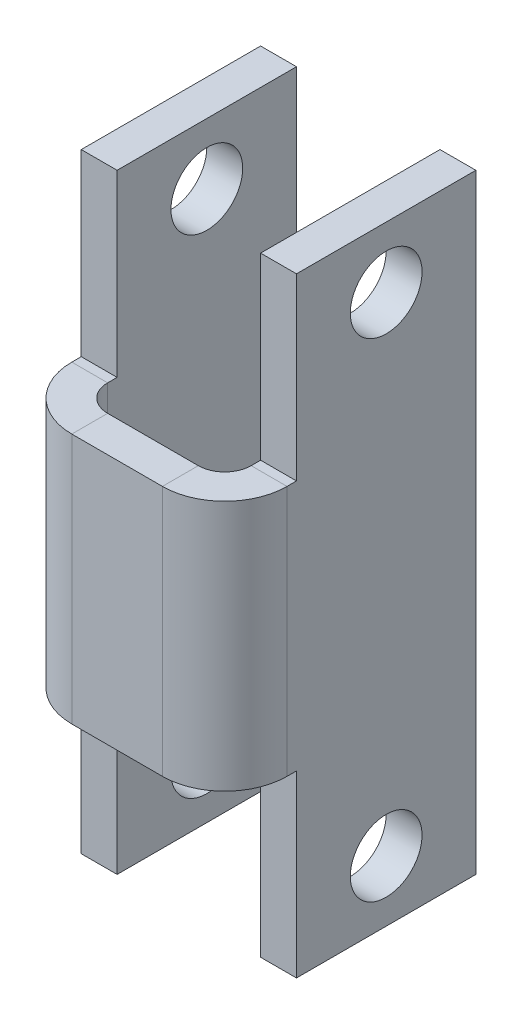
ISO-10303-21;
HEADER;
FILE_DESCRIPTION(('STEP AP214'),'2;1');
FILE_NAME('part.step','',(''),(''),'','','');
FILE_SCHEMA(('AUTOMOTIVE_DESIGN { 1 0 10303 214 1 1 1 1 }'));
ENDSEC;
DATA;
#1=APPLICATION_CONTEXT('core data for automotive mechanical design processes');
#2=APPLICATION_PROTOCOL_DEFINITION('international standard','automotive_design',2000,#1);
#3=PRODUCT_CONTEXT('',#1,'mechanical');
#4=PRODUCT('Part','Part','',(#3));
#5=PRODUCT_RELATED_PRODUCT_CATEGORY('part','',(#4));
#6=PRODUCT_DEFINITION_FORMATION('','',#4);
#7=PRODUCT_DEFINITION_CONTEXT('part definition',#1,'design');
#8=PRODUCT_DEFINITION('design','',#6,#7);
#9=PRODUCT_DEFINITION_SHAPE('','',#8);
#10=(LENGTH_UNIT() NAMED_UNIT(*) SI_UNIT(.MILLI.,.METRE.));
#11=(NAMED_UNIT(*) PLANE_ANGLE_UNIT() SI_UNIT($,.RADIAN.));
#12=(NAMED_UNIT(*) SI_UNIT($,.STERADIAN.) SOLID_ANGLE_UNIT());
#13=UNCERTAINTY_MEASURE_WITH_UNIT(LENGTH_MEASURE(1.E-05),#10,'distance_accuracy_value','');
#14=(GEOMETRIC_REPRESENTATION_CONTEXT(3) GLOBAL_UNCERTAINTY_ASSIGNED_CONTEXT((#13)) GLOBAL_UNIT_ASSIGNED_CONTEXT((#10,
#11,#12)) REPRESENTATION_CONTEXT('',''));
#15=CARTESIAN_POINT('',(0.,0.,0.));
#16=DIRECTION('',(0.,0.,1.));
#17=DIRECTION('',(1.,0.,0.));
#18=AXIS2_PLACEMENT_3D('',#15,#16,#17);
#19=CARTESIAN_POINT('',(-4.,5.,0.));
#20=DIRECTION('',(0.,1.,0.));
#21=DIRECTION('',(0.,0.,1.));
#22=AXIS2_PLACEMENT_3D('',#19,#20,#21);
#23=PLANE('',#22);
#24=DIRECTION('',(0.,0.,1.));
#25=VECTOR('',#24,1.);
#26=CARTESIAN_POINT('',(1.,5.,0.));
#27=LINE('',#26,#25);
#28=CARTESIAN_POINT('',(0.999999999999997,5.,-2.00000000000002));
#29=VERTEX_POINT('',#28);
#30=CARTESIAN_POINT('',(0.999999999999997,5.,-1.7366));
#31=VERTEX_POINT('',#30);
#32=EDGE_CURVE('E276',#29,#31,#27,.T.);
#33=ORIENTED_EDGE('',*,*,#32,.T.);
#34=DIRECTION('',(-1.,0.,0.));
#35=VECTOR('',#34,1.);
#36=CARTESIAN_POINT('',(0.999999999999997,5.,-1.7366));
#37=LINE('',#36,#35);
#38=CARTESIAN_POINT('',(0.,5.,-1.73659999999999));
#39=VERTEX_POINT('',#38);
#40=EDGE_CURVE('E13',#31,#39,#37,.T.);
#41=ORIENTED_EDGE('',*,*,#40,.T.);
#42=DIRECTION('',(0.,0.,1.));
#43=VECTOR('',#42,1.);
#44=CARTESIAN_POINT('',(0.,5.,0.));
#45=LINE('',#44,#43);
#46=CARTESIAN_POINT('',(0.,5.,-2.00000000000002));
#47=VERTEX_POINT('',#46);
#48=EDGE_CURVE('E332',#47,#39,#45,.T.);
#49=ORIENTED_EDGE('',*,*,#48,.F.);
#50=DIRECTION('',(1.,0.,0.));
#51=VECTOR('',#50,1.);
#52=CARTESIAN_POINT('',(-4.,5.,-2.00000000000003));
#53=LINE('',#52,#51);
#54=EDGE_CURVE('E315',#47,#29,#53,.T.);
#55=ORIENTED_EDGE('',*,*,#54,.T.);
#56=EDGE_LOOP('',(#33,#41,#49,#55));
#57=FACE_BOUND('',#56,.T.);
#58=ADVANCED_FACE('F81',(#57),#23,.F.);
#59=DIRECTION('',(1.,0.,0.));
#60=VECTOR('',#59,1.);
#61=CARTESIAN_POINT('',(-4.,5.,0.));
#62=LINE('',#61,#60);
#63=CARTESIAN_POINT('',(1.73659999999999,5.,0.));
#64=VERTEX_POINT('',#63);
#65=CARTESIAN_POINT('',(4.2634,5.,0.));
#66=VERTEX_POINT('',#65);
#67=EDGE_CURVE('E311',#64,#66,#62,.T.);
#68=ORIENTED_EDGE('',*,*,#67,.F.);
#69=DIRECTION('',(0.,0.,-1.));
#70=VECTOR('',#69,1.);
#71=CARTESIAN_POINT('',(1.73659999999999,5.,0.));
#72=LINE('',#71,#70);
#73=CARTESIAN_POINT('',(1.7366,5.,-1.));
#74=VERTEX_POINT('',#73);
#75=EDGE_CURVE('E90',#64,#74,#72,.T.);
#76=ORIENTED_EDGE('',*,*,#75,.T.);
#77=DIRECTION('',(1.,0.,0.));
#78=VECTOR('',#77,1.);
#79=CARTESIAN_POINT('',(0.,5.,-1.));
#80=LINE('',#79,#78);
#81=CARTESIAN_POINT('',(4.2634,5.,-1.));
#82=VERTEX_POINT('',#81);
#83=EDGE_CURVE('E324',#74,#82,#80,.T.);
#84=ORIENTED_EDGE('',*,*,#83,.T.);
#85=DIRECTION('',(0.,0.,1.));
#86=VECTOR('',#85,1.);
#87=CARTESIAN_POINT('',(4.2634,5.,-1.));
#88=LINE('',#87,#86);
#89=EDGE_CURVE('E288',#82,#66,#88,.T.);
#90=ORIENTED_EDGE('',*,*,#89,.T.);
#91=EDGE_LOOP('',(#68,#76,#84,#90));
#92=FACE_BOUND('',#91,.T.);
#93=ADVANCED_FACE('F503',(#92),#23,.F.);
#94=ORIENTED_EDGE('',*,*,#40,.F.);
#95=CARTESIAN_POINT('',(1.7366,5.,-1.7366));
#96=DIRECTION('',(0.,1.,0.));
#97=DIRECTION('',(0.,0.,1.));
#98=AXIS2_PLACEMENT_3D('',#95,#96,#97);
#99=CIRCLE('',#98,0.7366);
#100=EDGE_CURVE('E321',#74,#31,#99,.F.);
#101=ORIENTED_EDGE('',*,*,#100,.F.);
#102=ORIENTED_EDGE('',*,*,#75,.F.);
#103=CARTESIAN_POINT('',(1.7366,5.,-1.7366));
#104=DIRECTION('',(0.,1.,0.));
#105=DIRECTION('',(0.,0.,1.));
#106=AXIS2_PLACEMENT_3D('',#103,#104,#105);
#107=CIRCLE('',#106,1.7366);
#108=EDGE_CURVE('E335',#64,#39,#107,.F.);
#109=ORIENTED_EDGE('',*,*,#108,.T.);
#110=EDGE_LOOP('',(#94,#101,#102,#109));
#111=FACE_BOUND('',#110,.T.);
#112=ADVANCED_FACE('F508',(#111),#23,.F.);
#113=DIRECTION('',(0.,0.,1.));
#114=VECTOR('',#113,1.);
#115=CARTESIAN_POINT('',(6.,5.,0.));
#116=LINE('',#115,#114);
#117=CARTESIAN_POINT('',(6.,5.,-2.));
#118=VERTEX_POINT('',#117);
#119=CARTESIAN_POINT('',(6.,5.,-1.73659999999999));
#120=VERTEX_POINT('',#119);
#121=EDGE_CURVE('E230',#118,#120,#116,.T.);
#122=ORIENTED_EDGE('',*,*,#121,.T.);
#123=DIRECTION('',(-1.,0.,0.));
#124=VECTOR('',#123,1.);
#125=CARTESIAN_POINT('',(6.,5.,-1.73659999999999));
#126=LINE('',#125,#124);
#127=CARTESIAN_POINT('',(5.,5.,-1.7366));
#128=VERTEX_POINT('',#127);
#129=EDGE_CURVE('E286',#120,#128,#126,.T.);
#130=ORIENTED_EDGE('',*,*,#129,.T.);
#131=DIRECTION('',(0.,0.,-1.));
#132=VECTOR('',#131,1.);
#133=CARTESIAN_POINT('',(5.,5.,0.));
#134=LINE('',#133,#132);
#135=CARTESIAN_POINT('',(5.,5.,-2.));
#136=VERTEX_POINT('',#135);
#137=EDGE_CURVE('E330',#128,#136,#134,.T.);
#138=ORIENTED_EDGE('',*,*,#137,.T.);
#139=EDGE_CURVE('E316',#136,#118,#53,.T.);
#140=ORIENTED_EDGE('',*,*,#139,.T.);
#141=EDGE_LOOP('',(#122,#130,#138,#140));
#142=FACE_BOUND('',#141,.T.);
#143=ADVANCED_FACE('F506',(#142),#23,.F.);
#144=CARTESIAN_POINT('',(-4.,12.,0.));
#145=DIRECTION('',(0.,-1.,0.));
#146=DIRECTION('',(0.,0.,-1.));
#147=AXIS2_PLACEMENT_3D('',#144,#145,#146);
#148=PLANE('',#147);
#149=DIRECTION('',(0.,0.,-1.));
#150=VECTOR('',#149,1.);
#151=CARTESIAN_POINT('',(0.,12.,0.));
#152=LINE('',#151,#150);
#153=CARTESIAN_POINT('',(0.,12.,-1.73659999999999));
#154=VERTEX_POINT('',#153);
#155=CARTESIAN_POINT('',(0.,12.,-2.00000000000002));
#156=VERTEX_POINT('',#155);
#157=EDGE_CURVE('E368',#154,#156,#152,.T.);
#158=ORIENTED_EDGE('',*,*,#157,.F.);
#159=DIRECTION('',(1.,0.,0.));
#160=VECTOR('',#159,1.);
#161=CARTESIAN_POINT('',(0.,12.,-1.73659999999999));
#162=LINE('',#161,#160);
#163=CARTESIAN_POINT('',(0.999999999999997,12.,-1.7366));
#164=VERTEX_POINT('',#163);
#165=EDGE_CURVE('E106',#154,#164,#162,.T.);
#166=ORIENTED_EDGE('',*,*,#165,.T.);
#167=DIRECTION('',(0.,0.,-1.));
#168=VECTOR('',#167,1.);
#169=CARTESIAN_POINT('',(1.,12.,0.));
#170=LINE('',#169,#168);
#171=CARTESIAN_POINT('',(0.999999999999997,12.,-2.00000000000001));
#172=VERTEX_POINT('',#171);
#173=EDGE_CURVE('E267',#164,#172,#170,.T.);
#174=ORIENTED_EDGE('',*,*,#173,.T.);
#175=DIRECTION('',(1.,0.,0.));
#176=VECTOR('',#175,1.);
#177=CARTESIAN_POINT('',(-4.,12.,-2.00000000000003));
#178=LINE('',#177,#176);
#179=EDGE_CURVE('E351',#156,#172,#178,.T.);
#180=ORIENTED_EDGE('',*,*,#179,.F.);
#181=EDGE_LOOP('',(#158,#166,#174,#180));
#182=FACE_BOUND('',#181,.T.);
#183=ADVANCED_FACE('F462',(#182),#148,.F.);
#184=DIRECTION('',(-1.,0.,0.));
#185=VECTOR('',#184,1.);
#186=CARTESIAN_POINT('',(0.,12.,-1.));
#187=LINE('',#186,#185);
#188=CARTESIAN_POINT('',(4.2634,12.,-1.));
#189=VERTEX_POINT('',#188);
#190=CARTESIAN_POINT('',(1.7366,12.,-1.));
#191=VERTEX_POINT('',#190);
#192=EDGE_CURVE('E359',#189,#191,#187,.T.);
#193=ORIENTED_EDGE('',*,*,#192,.T.);
#194=DIRECTION('',(0.,0.,1.));
#195=VECTOR('',#194,1.);
#196=CARTESIAN_POINT('',(1.7366,12.,-1.));
#197=LINE('',#196,#195);
#198=CARTESIAN_POINT('',(1.73659999999999,12.,0.));
#199=VERTEX_POINT('',#198);
#200=EDGE_CURVE('E283',#191,#199,#197,.T.);
#201=ORIENTED_EDGE('',*,*,#200,.T.);
#202=DIRECTION('',(1.,0.,0.));
#203=VECTOR('',#202,1.);
#204=CARTESIAN_POINT('',(-4.,12.,0.));
#205=LINE('',#204,#203);
#206=CARTESIAN_POINT('',(4.2634,12.,0.));
#207=VERTEX_POINT('',#206);
#208=EDGE_CURVE('E346',#199,#207,#205,.T.);
#209=ORIENTED_EDGE('',*,*,#208,.T.);
#210=DIRECTION('',(0.,0.,-1.));
#211=VECTOR('',#210,1.);
#212=CARTESIAN_POINT('',(4.2634,12.,0.));
#213=LINE('',#212,#211);
#214=EDGE_CURVE('E279',#207,#189,#213,.T.);
#215=ORIENTED_EDGE('',*,*,#214,.T.);
#216=EDGE_LOOP('',(#193,#201,#209,#215));
#217=FACE_BOUND('',#216,.T.);
#218=ADVANCED_FACE('F447',(#217),#148,.F.);
#219=DIRECTION('',(0.,0.,1.));
#220=VECTOR('',#219,1.);
#221=CARTESIAN_POINT('',(5.,12.,0.));
#222=LINE('',#221,#220);
#223=CARTESIAN_POINT('',(5.,12.,-2.));
#224=VERTEX_POINT('',#223);
#225=CARTESIAN_POINT('',(5.,12.,-1.7366));
#226=VERTEX_POINT('',#225);
#227=EDGE_CURVE('E365',#224,#226,#222,.T.);
#228=ORIENTED_EDGE('',*,*,#227,.T.);
#229=DIRECTION('',(1.,0.,0.));
#230=VECTOR('',#229,1.);
#231=CARTESIAN_POINT('',(5.,12.,-1.7366));
#232=LINE('',#231,#230);
#233=CARTESIAN_POINT('',(6.,12.,-1.73659999999999));
#234=VERTEX_POINT('',#233);
#235=EDGE_CURVE('E281',#226,#234,#232,.T.);
#236=ORIENTED_EDGE('',*,*,#235,.T.);
#237=DIRECTION('',(0.,0.,-1.));
#238=VECTOR('',#237,1.);
#239=CARTESIAN_POINT('',(6.,12.,0.));
#240=LINE('',#239,#238);
#241=CARTESIAN_POINT('',(6.,12.,-1.99999999999999));
#242=VERTEX_POINT('',#241);
#243=EDGE_CURVE('E341',#234,#242,#240,.T.);
#244=ORIENTED_EDGE('',*,*,#243,.T.);
#245=EDGE_CURVE('E352',#224,#242,#178,.T.);
#246=ORIENTED_EDGE('',*,*,#245,.F.);
#247=EDGE_LOOP('',(#228,#236,#244,#246));
#248=FACE_BOUND('',#247,.T.);
#249=ADVANCED_FACE('F434',(#248),#148,.F.);
#250=ORIENTED_EDGE('',*,*,#165,.F.);
#251=CARTESIAN_POINT('',(1.7366,12.,-1.7366));
#252=DIRECTION('',(0.,-1.,0.));
#253=DIRECTION('',(0.,0.,-1.));
#254=AXIS2_PLACEMENT_3D('',#251,#252,#253);
#255=CIRCLE('',#254,1.7366);
#256=EDGE_CURVE('E371',#154,#199,#255,.F.);
#257=ORIENTED_EDGE('',*,*,#256,.T.);
#258=ORIENTED_EDGE('',*,*,#200,.F.);
#259=CARTESIAN_POINT('',(1.7366,12.,-1.7366));
#260=DIRECTION('',(0.,-1.,0.));
#261=DIRECTION('',(0.,0.,-1.));
#262=AXIS2_PLACEMENT_3D('',#259,#260,#261);
#263=CIRCLE('',#262,0.7366);
#264=EDGE_CURVE('E356',#164,#191,#263,.F.);
#265=ORIENTED_EDGE('',*,*,#264,.F.);
#266=EDGE_LOOP('',(#250,#257,#258,#265));
#267=FACE_BOUND('',#266,.T.);
#268=ADVANCED_FACE('F454',(#267),#148,.F.);
#269=CARTESIAN_POINT('',(0.,0.,-1.));
#270=DIRECTION('',(0.,0.,-1.));
#271=DIRECTION('',(-1.,0.,0.));
#272=AXIS2_PLACEMENT_3D('',#269,#270,#271);
#273=PLANE('',#272);
#274=ORIENTED_EDGE('',*,*,#83,.F.);
#275=DIRECTION('',(0.,1.,0.));
#276=VECTOR('',#275,1.);
#277=CARTESIAN_POINT('',(1.7366,17.,-1.));
#278=LINE('',#277,#276);
#279=EDGE_CURVE('E386',#191,#74,#278,.F.);
#280=ORIENTED_EDGE('',*,*,#279,.F.);
#281=ORIENTED_EDGE('',*,*,#192,.F.);
#282=DIRECTION('',(0.,-1.,0.));
#283=VECTOR('',#282,1.);
#284=CARTESIAN_POINT('',(4.2634,0.,-0.999999999999999));
#285=LINE('',#284,#283);
#286=EDGE_CURVE('E268',#82,#189,#285,.F.);
#287=ORIENTED_EDGE('',*,*,#286,.F.);
#288=EDGE_LOOP('',(#274,#280,#281,#287));
#289=FACE_BOUND('',#288,.T.);
#290=ADVANCED_FACE('F445',(#289),#273,.T.);
#291=CARTESIAN_POINT('',(0.,0.,0.));
#292=DIRECTION('',(0.,0.,-1.));
#293=DIRECTION('',(-1.,0.,0.));
#294=AXIS2_PLACEMENT_3D('',#291,#292,#293);
#295=PLANE('',#294);
#296=DIRECTION('',(0.,1.,0.));
#297=VECTOR('',#296,1.);
#298=CARTESIAN_POINT('',(1.7366,17.,0.));
#299=LINE('',#298,#297);
#300=EDGE_CURVE('E263',#199,#64,#299,.F.);
#301=ORIENTED_EDGE('',*,*,#300,.T.);
#302=ORIENTED_EDGE('',*,*,#67,.T.);
#303=DIRECTION('',(0.,-1.,0.));
#304=VECTOR('',#303,1.);
#305=CARTESIAN_POINT('',(4.2634,0.,0.));
#306=LINE('',#305,#304);
#307=EDGE_CURVE('E264',#66,#207,#306,.F.);
#308=ORIENTED_EDGE('',*,*,#307,.T.);
#309=ORIENTED_EDGE('',*,*,#208,.F.);
#310=EDGE_LOOP('',(#301,#302,#308,#309));
#311=FACE_BOUND('',#310,.T.);
#312=ADVANCED_FACE('F83',(#311),#295,.F.);
#313=CARTESIAN_POINT('',(4.2634,0.,-1.7366));
#314=DIRECTION('',(0.,-1.,0.));
#315=DIRECTION('',(1.,0.,0.));
#316=AXIS2_PLACEMENT_3D('',#313,#314,#315);
#317=CYLINDRICAL_SURFACE('',#316,1.7366);
#318=CARTESIAN_POINT('',(4.2634,5.,-1.7366));
#319=DIRECTION('',(0.,1.,0.));
#320=DIRECTION('',(0.,0.,1.));
#321=AXIS2_PLACEMENT_3D('',#318,#319,#320);
#322=CIRCLE('',#321,1.7366);
#323=EDGE_CURVE('E338',#120,#66,#322,.F.);
#324=ORIENTED_EDGE('',*,*,#323,.F.);
#325=DIRECTION('',(0.,-1.,0.));
#326=VECTOR('',#325,1.);
#327=CARTESIAN_POINT('',(6.,17.,-1.73659999999999));
#328=LINE('',#327,#326);
#329=EDGE_CURVE('E257',#120,#234,#328,.F.);
#330=ORIENTED_EDGE('',*,*,#329,.T.);
#331=CARTESIAN_POINT('',(4.2634,12.,-1.7366));
#332=DIRECTION('',(0.,-1.,0.));
#333=DIRECTION('',(0.,0.,-1.));
#334=AXIS2_PLACEMENT_3D('',#331,#332,#333);
#335=CIRCLE('',#334,1.7366);
#336=EDGE_CURVE('E374',#207,#234,#335,.F.);
#337=ORIENTED_EDGE('',*,*,#336,.F.);
#338=ORIENTED_EDGE('',*,*,#307,.F.);
#339=EDGE_LOOP('',(#324,#330,#337,#338));
#340=FACE_BOUND('',#339,.T.);
#341=ADVANCED_FACE('F497',(#340),#317,.T.);
#342=CARTESIAN_POINT('',(4.2634,0.,-1.7366));
#343=DIRECTION('',(0.,-1.,0.));
#344=DIRECTION('',(1.,0.,0.));
#345=AXIS2_PLACEMENT_3D('',#342,#343,#344);
#346=CYLINDRICAL_SURFACE('',#345,0.7366);
#347=DIRECTION('',(0.,-1.,0.));
#348=VECTOR('',#347,1.);
#349=CARTESIAN_POINT('',(5.,17.,-1.7366));
#350=LINE('',#349,#348);
#351=EDGE_CURVE('E260',#226,#128,#350,.T.);
#352=ORIENTED_EDGE('',*,*,#351,.T.);
#353=CARTESIAN_POINT('',(4.2634,5.,-1.7366));
#354=DIRECTION('',(0.,1.,0.));
#355=DIRECTION('',(0.,0.,1.));
#356=AXIS2_PLACEMENT_3D('',#353,#354,#355);
#357=CIRCLE('',#356,0.7366);
#358=EDGE_CURVE('E327',#128,#82,#357,.F.);
#359=ORIENTED_EDGE('',*,*,#358,.T.);
#360=ORIENTED_EDGE('',*,*,#286,.T.);
#361=CARTESIAN_POINT('',(4.2634,12.,-1.7366));
#362=DIRECTION('',(0.,-1.,0.));
#363=DIRECTION('',(0.,0.,-1.));
#364=AXIS2_PLACEMENT_3D('',#361,#362,#363);
#365=CIRCLE('',#364,0.7366);
#366=EDGE_CURVE('E362',#189,#226,#365,.F.);
#367=ORIENTED_EDGE('',*,*,#366,.T.);
#368=EDGE_LOOP('',(#352,#359,#360,#367));
#369=FACE_BOUND('',#368,.T.);
#370=ADVANCED_FACE('F437',(#369),#346,.F.);
#371=CARTESIAN_POINT('',(6.00000000000002,0.,-7.));
#372=DIRECTION('',(0.,1.,0.));
#373=DIRECTION('',(0.,0.,1.));
#374=AXIS2_PLACEMENT_3D('',#371,#372,#373);
#375=PLANE('',#374);
#376=DIRECTION('',(0.,0.,-1.));
#377=VECTOR('',#376,1.);
#378=CARTESIAN_POINT('',(6.,0.,0.));
#379=LINE('',#378,#377);
#380=CARTESIAN_POINT('',(6.,0.,-2.));
#381=VERTEX_POINT('',#380);
#382=CARTESIAN_POINT('',(6.00000000000002,0.,-7.));
#383=VERTEX_POINT('',#382);
#384=EDGE_CURVE('E235',#381,#383,#379,.T.);
#385=ORIENTED_EDGE('',*,*,#384,.F.);
#386=DIRECTION('',(1.,0.,0.));
#387=VECTOR('',#386,1.);
#388=CARTESIAN_POINT('',(-4.,0.,-2.00000000000003));
#389=LINE('',#388,#387);
#390=CARTESIAN_POINT('',(5.,0.,-2.));
#391=VERTEX_POINT('',#390);
#392=EDGE_CURVE('E219',#391,#381,#389,.T.);
#393=ORIENTED_EDGE('',*,*,#392,.F.);
#394=DIRECTION('',(0.,0.,1.));
#395=VECTOR('',#394,1.);
#396=CARTESIAN_POINT('',(5.00000000000002,0.,-7.));
#397=LINE('',#396,#395);
#398=CARTESIAN_POINT('',(5.00000000000002,0.,-7.));
#399=VERTEX_POINT('',#398);
#400=EDGE_CURVE('E255',#391,#399,#397,.F.);
#401=ORIENTED_EDGE('',*,*,#400,.T.);
#402=DIRECTION('',(-1.,0.,0.));
#403=VECTOR('',#402,1.);
#404=CARTESIAN_POINT('',(6.00000000000002,0.,-7.));
#405=LINE('',#404,#403);
#406=EDGE_CURVE('E242',#383,#399,#405,.T.);
#407=ORIENTED_EDGE('',*,*,#406,.F.);
#408=EDGE_LOOP('',(#385,#393,#401,#407));
#409=FACE_BOUND('',#408,.T.);
#410=ADVANCED_FACE('F240',(#409),#375,.F.);
#411=CARTESIAN_POINT('',(6.,17.,-0.999999999999997));
#412=DIRECTION('',(0.,-1.,0.));
#413=DIRECTION('',(0.,0.,-1.));
#414=AXIS2_PLACEMENT_3D('',#411,#412,#413);
#415=PLANE('',#414);
#416=DIRECTION('',(0.,0.,-1.));
#417=VECTOR('',#416,1.);
#418=CARTESIAN_POINT('',(5.,17.,-1.));
#419=LINE('',#418,#417);
#420=CARTESIAN_POINT('',(5.00000000000002,17.,-7.));
#421=VERTEX_POINT('',#420);
#422=CARTESIAN_POINT('',(5.,17.,-2.));
#423=VERTEX_POINT('',#422);
#424=EDGE_CURVE('E245',#421,#423,#419,.F.);
#425=ORIENTED_EDGE('',*,*,#424,.T.);
#426=DIRECTION('',(1.,0.,0.));
#427=VECTOR('',#426,1.);
#428=CARTESIAN_POINT('',(-4.,17.,-2.00000000000003));
#429=LINE('',#428,#427);
#430=CARTESIAN_POINT('',(6.,17.,-1.99999999999999));
#431=VERTEX_POINT('',#430);
#432=EDGE_CURVE('E347',#423,#431,#429,.T.);
#433=ORIENTED_EDGE('',*,*,#432,.T.);
#434=DIRECTION('',(0.,0.,1.));
#435=VECTOR('',#434,1.);
#436=CARTESIAN_POINT('',(6.,17.,0.));
#437=LINE('',#436,#435);
#438=CARTESIAN_POINT('',(6.00000000000002,17.,-7.));
#439=VERTEX_POINT('',#438);
#440=EDGE_CURVE('E247',#439,#431,#437,.T.);
#441=ORIENTED_EDGE('',*,*,#440,.F.);
#442=DIRECTION('',(-1.,0.,0.));
#443=VECTOR('',#442,1.);
#444=CARTESIAN_POINT('',(6.00000000000002,17.,-7.));
#445=LINE('',#444,#443);
#446=EDGE_CURVE('E413',#439,#421,#445,.T.);
#447=ORIENTED_EDGE('',*,*,#446,.T.);
#448=EDGE_LOOP('',(#425,#433,#441,#447));
#449=FACE_BOUND('',#448,.T.);
#450=ADVANCED_FACE('F421',(#449),#415,.F.);
#451=CARTESIAN_POINT('',(6.,0.,0.));
#452=DIRECTION('',(-1.,0.,0.));
#453=DIRECTION('',(0.,0.,1.));
#454=AXIS2_PLACEMENT_3D('',#451,#452,#453);
#455=PLANE('',#454);
#456=CARTESIAN_POINT('',(6.00000000000001,1.7,-4.5));
#457=DIRECTION('',(1.,0.,0.));
#458=DIRECTION('',(0.,0.,1.));
#459=AXIS2_PLACEMENT_3D('',#456,#457,#458);
#460=CIRCLE('',#459,1.);
#461=CARTESIAN_POINT('',(6.00000000000001,1.7,-3.5));
#462=VERTEX_POINT('',#461);
#463=EDGE_CURVE('E852',#462,#462,#460,.T.);
#464=ORIENTED_EDGE('',*,*,#463,.F.);
#465=EDGE_LOOP('',(#464));
#466=FACE_BOUND('',#465,.T.);
#467=CARTESIAN_POINT('',(6.00000000000001,15.3,-4.5));
#468=DIRECTION('',(1.,0.,0.));
#469=DIRECTION('',(0.,0.,-1.));
#470=AXIS2_PLACEMENT_3D('',#467,#468,#469);
#471=CIRCLE('',#470,1.);
#472=CARTESIAN_POINT('',(6.00000000000002,15.3,-5.5));
#473=VERTEX_POINT('',#472);
#474=EDGE_CURVE('E293',#473,#473,#471,.T.);
#475=ORIENTED_EDGE('',*,*,#474,.F.);
#476=EDGE_LOOP('',(#475));
#477=FACE_BOUND('',#476,.T.);
#478=ORIENTED_EDGE('',*,*,#329,.F.);
#479=ORIENTED_EDGE('',*,*,#121,.F.);
#480=DIRECTION('',(0.,1.,0.));
#481=VECTOR('',#480,1.);
#482=CARTESIAN_POINT('',(6.,0.,-2.));
#483=LINE('',#482,#481);
#484=EDGE_CURVE('E223',#381,#118,#483,.T.);
#485=ORIENTED_EDGE('',*,*,#484,.F.);
#486=ORIENTED_EDGE('',*,*,#384,.T.);
#487=DIRECTION('',(0.,1.,0.));
#488=VECTOR('',#487,1.);
#489=CARTESIAN_POINT('',(6.00000000000002,0.,-7.));
#490=LINE('',#489,#488);
#491=EDGE_CURVE('E244',#383,#439,#490,.T.);
#492=ORIENTED_EDGE('',*,*,#491,.T.);
#493=ORIENTED_EDGE('',*,*,#440,.T.);
#494=DIRECTION('',(0.,1.,0.));
#495=VECTOR('',#494,1.);
#496=CARTESIAN_POINT('',(6.,17.,-1.99999999999999));
#497=LINE('',#496,#495);
#498=EDGE_CURVE('E344',#242,#431,#497,.T.);
#499=ORIENTED_EDGE('',*,*,#498,.F.);
#500=ORIENTED_EDGE('',*,*,#243,.F.);
#501=EDGE_LOOP('',(#478,#479,#485,#486,#492,#493,#499,#500));
#502=FACE_BOUND('',#501,.T.);
#503=ADVANCED_FACE('F234',(#466,#477,#502),#455,.F.);
#504=CARTESIAN_POINT('',(5.,0.,0.));
#505=DIRECTION('',(-1.,0.,0.));
#506=DIRECTION('',(0.,0.,1.));
#507=AXIS2_PLACEMENT_3D('',#504,#505,#506);
#508=PLANE('',#507);
#509=CARTESIAN_POINT('',(5.00000000000001,1.7,-4.5));
#510=DIRECTION('',(-1.,0.,0.));
#511=DIRECTION('',(0.,0.,1.));
#512=AXIS2_PLACEMENT_3D('',#509,#510,#511);
#513=CIRCLE('',#512,1.);
#514=CARTESIAN_POINT('',(5.00000000000001,1.7,-3.5));
#515=VERTEX_POINT('',#514);
#516=EDGE_CURVE('E299',#515,#515,#513,.T.);
#517=ORIENTED_EDGE('',*,*,#516,.F.);
#518=EDGE_LOOP('',(#517));
#519=FACE_BOUND('',#518,.T.);
#520=CARTESIAN_POINT('',(5.00000000000001,15.3,-4.5));
#521=DIRECTION('',(-1.,0.,0.));
#522=DIRECTION('',(0.,0.,1.));
#523=AXIS2_PLACEMENT_3D('',#520,#521,#522);
#524=CIRCLE('',#523,1.);
#525=CARTESIAN_POINT('',(5.00000000000001,15.3,-3.5));
#526=VERTEX_POINT('',#525);
#527=EDGE_CURVE('E238',#526,#526,#524,.T.);
#528=ORIENTED_EDGE('',*,*,#527,.F.);
#529=EDGE_LOOP('',(#528));
#530=FACE_BOUND('',#529,.T.);
#531=ORIENTED_EDGE('',*,*,#137,.F.);
#532=ORIENTED_EDGE('',*,*,#351,.F.);
#533=ORIENTED_EDGE('',*,*,#227,.F.);
#534=DIRECTION('',(0.,-1.,0.));
#535=VECTOR('',#534,1.);
#536=CARTESIAN_POINT('',(5.,0.,-2.));
#537=LINE('',#536,#535);
#538=EDGE_CURVE('E380',#423,#224,#537,.T.);
#539=ORIENTED_EDGE('',*,*,#538,.F.);
#540=ORIENTED_EDGE('',*,*,#424,.F.);
#541=DIRECTION('',(0.,-1.,0.));
#542=VECTOR('',#541,1.);
#543=CARTESIAN_POINT('',(5.00000000000002,17.,-7.));
#544=LINE('',#543,#542);
#545=EDGE_CURVE('E250',#399,#421,#544,.F.);
#546=ORIENTED_EDGE('',*,*,#545,.F.);
#547=ORIENTED_EDGE('',*,*,#400,.F.);
#548=DIRECTION('',(0.,-1.,0.));
#549=VECTOR('',#548,1.);
#550=CARTESIAN_POINT('',(5.,0.,-2.));
#551=LINE('',#550,#549);
#552=EDGE_CURVE('E226',#136,#391,#551,.T.);
#553=ORIENTED_EDGE('',*,*,#552,.F.);
#554=EDGE_LOOP('',(#531,#532,#533,#539,#540,#546,#547,#553));
#555=FACE_BOUND('',#554,.T.);
#556=ADVANCED_FACE('F430',(#519,#530,#555),#508,.T.);
#557=CARTESIAN_POINT('',(6.00000000000002,17.,-7.));
#558=DIRECTION('',(0.,0.,1.));
#559=DIRECTION('',(1.,0.,0.));
#560=AXIS2_PLACEMENT_3D('',#557,#558,#559);
#561=PLANE('',#560);
#562=ORIENTED_EDGE('',*,*,#545,.T.);
#563=ORIENTED_EDGE('',*,*,#446,.F.);
#564=ORIENTED_EDGE('',*,*,#491,.F.);
#565=ORIENTED_EDGE('',*,*,#406,.T.);
#566=EDGE_LOOP('',(#562,#563,#564,#565));
#567=FACE_BOUND('',#566,.T.);
#568=ADVANCED_FACE('F631',(#567),#561,.F.);
#569=CARTESIAN_POINT('',(1.7366,17.,-1.7366));
#570=DIRECTION('',(0.,1.,0.));
#571=DIRECTION('',(-1.,0.,0.));
#572=AXIS2_PLACEMENT_3D('',#569,#570,#571);
#573=CYLINDRICAL_SURFACE('',#572,1.7366);
#574=ORIENTED_EDGE('',*,*,#108,.F.);
#575=ORIENTED_EDGE('',*,*,#300,.F.);
#576=ORIENTED_EDGE('',*,*,#256,.F.);
#577=DIRECTION('',(0.,1.,0.));
#578=VECTOR('',#577,1.);
#579=CARTESIAN_POINT('',(0.,0.,-1.73659999999999));
#580=LINE('',#579,#578);
#581=EDGE_CURVE('E404',#154,#39,#580,.F.);
#582=ORIENTED_EDGE('',*,*,#581,.T.);
#583=EDGE_LOOP('',(#574,#575,#576,#582));
#584=FACE_BOUND('',#583,.T.);
#585=ADVANCED_FACE('F489',(#584),#573,.T.);
#586=CARTESIAN_POINT('',(1.7366,17.,-1.7366));
#587=DIRECTION('',(0.,1.,0.));
#588=DIRECTION('',(-1.,0.,0.));
#589=AXIS2_PLACEMENT_3D('',#586,#587,#588);
#590=CYLINDRICAL_SURFACE('',#589,0.7366);
#591=ORIENTED_EDGE('',*,*,#279,.T.);
#592=ORIENTED_EDGE('',*,*,#100,.T.);
#593=DIRECTION('',(0.,1.,0.));
#594=VECTOR('',#593,1.);
#595=CARTESIAN_POINT('',(0.999999999999997,0.,-1.7366));
#596=LINE('',#595,#594);
#597=EDGE_CURVE('E382',#31,#164,#596,.T.);
#598=ORIENTED_EDGE('',*,*,#597,.T.);
#599=ORIENTED_EDGE('',*,*,#264,.T.);
#600=EDGE_LOOP('',(#591,#592,#598,#599));
#601=FACE_BOUND('',#600,.T.);
#602=ADVANCED_FACE('F450',(#601),#590,.F.);
#603=CARTESIAN_POINT('',(0.,17.,-7.));
#604=DIRECTION('',(0.,-1.,0.));
#605=DIRECTION('',(0.,0.,-1.));
#606=AXIS2_PLACEMENT_3D('',#603,#604,#605);
#607=PLANE('',#606);
#608=DIRECTION('',(0.,0.,-1.));
#609=VECTOR('',#608,1.);
#610=CARTESIAN_POINT('',(0.,17.,0.));
#611=LINE('',#610,#609);
#612=CARTESIAN_POINT('',(0.,17.,-2.00000000000001));
#613=VERTEX_POINT('',#612);
#614=CARTESIAN_POINT('',(0.,17.,-7.));
#615=VERTEX_POINT('',#614);
#616=EDGE_CURVE('E395',#613,#615,#611,.T.);
#617=ORIENTED_EDGE('',*,*,#616,.F.);
#618=CARTESIAN_POINT('',(0.999999999999997,17.,-2.00000000000001));
#619=VERTEX_POINT('',#618);
#620=EDGE_CURVE('E350',#613,#619,#429,.T.);
#621=ORIENTED_EDGE('',*,*,#620,.T.);
#622=DIRECTION('',(0.,0.,1.));
#623=VECTOR('',#622,1.);
#624=CARTESIAN_POINT('',(0.999999999999979,17.,-7.));
#625=LINE('',#624,#623);
#626=CARTESIAN_POINT('',(0.999999999999979,17.,-7.));
#627=VERTEX_POINT('',#626);
#628=EDGE_CURVE('E402',#619,#627,#625,.F.);
#629=ORIENTED_EDGE('',*,*,#628,.T.);
#630=DIRECTION('',(1.,0.,0.));
#631=VECTOR('',#630,1.);
#632=CARTESIAN_POINT('',(0.,17.,-7.));
#633=LINE('',#632,#631);
#634=EDGE_CURVE('E383',#615,#627,#633,.T.);
#635=ORIENTED_EDGE('',*,*,#634,.F.);
#636=EDGE_LOOP('',(#617,#621,#629,#635));
#637=FACE_BOUND('',#636,.T.);
#638=ADVANCED_FACE('F473',(#637),#607,.F.);
#639=CARTESIAN_POINT('',(0.,0.,-0.999999999999997));
#640=DIRECTION('',(0.,1.,0.));
#641=DIRECTION('',(0.,0.,1.));
#642=AXIS2_PLACEMENT_3D('',#639,#640,#641);
#643=PLANE('',#642);
#644=DIRECTION('',(0.,0.,-1.));
#645=VECTOR('',#644,1.);
#646=CARTESIAN_POINT('',(1.,0.,-1.));
#647=LINE('',#646,#645);
#648=CARTESIAN_POINT('',(0.999999999999979,0.,-7.));
#649=VERTEX_POINT('',#648);
#650=CARTESIAN_POINT('',(0.999999999999997,0.,-2.00000000000001));
#651=VERTEX_POINT('',#650);
#652=EDGE_CURVE('E397',#649,#651,#647,.F.);
#653=ORIENTED_EDGE('',*,*,#652,.T.);
#654=CARTESIAN_POINT('',(0.,0.,-2.00000000000002));
#655=VERTEX_POINT('',#654);
#656=EDGE_CURVE('E98',#655,#651,#389,.T.);
#657=ORIENTED_EDGE('',*,*,#656,.F.);
#658=DIRECTION('',(0.,0.,1.));
#659=VECTOR('',#658,1.);
#660=CARTESIAN_POINT('',(0.,0.,0.));
#661=LINE('',#660,#659);
#662=CARTESIAN_POINT('',(0.,0.,-7.));
#663=VERTEX_POINT('',#662);
#664=EDGE_CURVE('E390',#663,#655,#661,.T.);
#665=ORIENTED_EDGE('',*,*,#664,.F.);
#666=DIRECTION('',(1.,0.,0.));
#667=VECTOR('',#666,1.);
#668=CARTESIAN_POINT('',(0.,0.,-7.));
#669=LINE('',#668,#667);
#670=EDGE_CURVE('E387',#663,#649,#669,.T.);
#671=ORIENTED_EDGE('',*,*,#670,.T.);
#672=EDGE_LOOP('',(#653,#657,#665,#671));
#673=FACE_BOUND('',#672,.T.);
#674=ADVANCED_FACE('F480',(#673),#643,.F.);
#675=CARTESIAN_POINT('',(0.,0.,0.));
#676=DIRECTION('',(1.,0.,0.));
#677=DIRECTION('',(0.,0.,-1.));
#678=AXIS2_PLACEMENT_3D('',#675,#676,#677);
#679=PLANE('',#678);
#680=CARTESIAN_POINT('',(0.,1.7,-4.50000000000002));
#681=DIRECTION('',(1.,0.,0.));
#682=DIRECTION('',(0.,0.,-1.));
#683=AXIS2_PLACEMENT_3D('',#680,#681,#682);
#684=CIRCLE('',#683,1.);
#685=CARTESIAN_POINT('',(0.,1.7,-5.50000000000002));
#686=VERTEX_POINT('',#685);
#687=EDGE_CURVE('E304',#686,#686,#684,.T.);
#688=ORIENTED_EDGE('',*,*,#687,.T.);
#689=EDGE_LOOP('',(#688));
#690=FACE_BOUND('',#689,.T.);
#691=CARTESIAN_POINT('',(0.,15.3,-4.50000000000002));
#692=DIRECTION('',(1.,0.,0.));
#693=DIRECTION('',(0.,0.,-1.));
#694=AXIS2_PLACEMENT_3D('',#691,#692,#693);
#695=CIRCLE('',#694,1.);
#696=CARTESIAN_POINT('',(0.,15.3,-5.50000000000002));
#697=VERTEX_POINT('',#696);
#698=EDGE_CURVE('E292',#697,#697,#695,.T.);
#699=ORIENTED_EDGE('',*,*,#698,.T.);
#700=EDGE_LOOP('',(#699));
#701=FACE_BOUND('',#700,.T.);
#702=DIRECTION('',(0.,1.,0.));
#703=VECTOR('',#702,1.);
#704=CARTESIAN_POINT('',(0.,0.,-2.00000000000002));
#705=LINE('',#704,#703);
#706=EDGE_CURVE('E314',#655,#47,#705,.T.);
#707=ORIENTED_EDGE('',*,*,#706,.T.);
#708=ORIENTED_EDGE('',*,*,#48,.T.);
#709=ORIENTED_EDGE('',*,*,#581,.F.);
#710=ORIENTED_EDGE('',*,*,#157,.T.);
#711=DIRECTION('',(0.,1.,0.));
#712=VECTOR('',#711,1.);
#713=CARTESIAN_POINT('',(0.,0.,-2.00000000000002));
#714=LINE('',#713,#712);
#715=EDGE_CURVE('E377',#156,#613,#714,.T.);
#716=ORIENTED_EDGE('',*,*,#715,.T.);
#717=ORIENTED_EDGE('',*,*,#616,.T.);
#718=DIRECTION('',(0.,-1.,0.));
#719=VECTOR('',#718,1.);
#720=CARTESIAN_POINT('',(0.,0.,-7.));
#721=LINE('',#720,#719);
#722=EDGE_CURVE('E393',#615,#663,#721,.T.);
#723=ORIENTED_EDGE('',*,*,#722,.T.);
#724=ORIENTED_EDGE('',*,*,#664,.T.);
#725=EDGE_LOOP('',(#707,#708,#709,#710,#716,#717,#723,#724));
#726=FACE_BOUND('',#725,.T.);
#727=ADVANCED_FACE('F468',(#690,#701,#726),#679,.F.);
#728=CARTESIAN_POINT('',(1.,0.,0.));
#729=DIRECTION('',(1.,0.,0.));
#730=DIRECTION('',(0.,0.,-1.));
#731=AXIS2_PLACEMENT_3D('',#728,#729,#730);
#732=PLANE('',#731);
#733=CARTESIAN_POINT('',(0.999999999999988,1.7,-4.50000000000001));
#734=DIRECTION('',(1.,0.,0.));
#735=DIRECTION('',(0.,0.,-1.));
#736=AXIS2_PLACEMENT_3D('',#733,#734,#735);
#737=CIRCLE('',#736,1.);
#738=CARTESIAN_POINT('',(0.999999999999984,1.7,-5.50000000000001));
#739=VERTEX_POINT('',#738);
#740=EDGE_CURVE('E85',#739,#739,#737,.T.);
#741=ORIENTED_EDGE('',*,*,#740,.F.);
#742=EDGE_LOOP('',(#741));
#743=FACE_BOUND('',#742,.T.);
#744=CARTESIAN_POINT('',(0.999999999999988,15.3,-4.50000000000001));
#745=DIRECTION('',(1.,0.,0.));
#746=DIRECTION('',(0.,0.,-1.));
#747=AXIS2_PLACEMENT_3D('',#744,#745,#746);
#748=CIRCLE('',#747,1.);
#749=CARTESIAN_POINT('',(0.999999999999984,15.3,-5.50000000000001));
#750=VERTEX_POINT('',#749);
#751=EDGE_CURVE('E290',#750,#750,#748,.T.);
#752=ORIENTED_EDGE('',*,*,#751,.F.);
#753=EDGE_LOOP('',(#752));
#754=FACE_BOUND('',#753,.T.);
#755=ORIENTED_EDGE('',*,*,#32,.F.);
#756=DIRECTION('',(0.,1.,0.));
#757=VECTOR('',#756,1.);
#758=CARTESIAN_POINT('',(0.999999999999997,0.,-2.00000000000001));
#759=LINE('',#758,#757);
#760=EDGE_CURVE('E274',#651,#29,#759,.T.);
#761=ORIENTED_EDGE('',*,*,#760,.F.);
#762=ORIENTED_EDGE('',*,*,#652,.F.);
#763=DIRECTION('',(0.,1.,0.));
#764=VECTOR('',#763,1.);
#765=CARTESIAN_POINT('',(0.999999999999979,0.,-7.));
#766=LINE('',#765,#764);
#767=EDGE_CURVE('E400',#627,#649,#766,.F.);
#768=ORIENTED_EDGE('',*,*,#767,.F.);
#769=ORIENTED_EDGE('',*,*,#628,.F.);
#770=DIRECTION('',(0.,1.,0.));
#771=VECTOR('',#770,1.);
#772=CARTESIAN_POINT('',(0.999999999999997,0.,-2.00000000000001));
#773=LINE('',#772,#771);
#774=EDGE_CURVE('E272',#172,#619,#773,.T.);
#775=ORIENTED_EDGE('',*,*,#774,.F.);
#776=ORIENTED_EDGE('',*,*,#173,.F.);
#777=ORIENTED_EDGE('',*,*,#597,.F.);
#778=EDGE_LOOP('',(#755,#761,#762,#768,#769,#775,#776,#777));
#779=FACE_BOUND('',#778,.T.);
#780=ADVANCED_FACE('F458',(#743,#754,#779),#732,.T.);
#781=CARTESIAN_POINT('',(0.,0.,-7.));
#782=DIRECTION('',(0.,0.,1.));
#783=DIRECTION('',(1.,0.,0.));
#784=AXIS2_PLACEMENT_3D('',#781,#782,#783);
#785=PLANE('',#784);
#786=ORIENTED_EDGE('',*,*,#767,.T.);
#787=ORIENTED_EDGE('',*,*,#670,.F.);
#788=ORIENTED_EDGE('',*,*,#722,.F.);
#789=ORIENTED_EDGE('',*,*,#634,.T.);
#790=EDGE_LOOP('',(#786,#787,#788,#789));
#791=FACE_BOUND('',#790,.T.);
#792=ADVANCED_FACE('F476',(#791),#785,.F.);
#793=CARTESIAN_POINT('',(-4.,17.,-2.00000000000003));
#794=DIRECTION('',(0.,0.,-1.));
#795=DIRECTION('',(-1.,0.,0.));
#796=AXIS2_PLACEMENT_3D('',#793,#794,#795);
#797=PLANE('',#796);
#798=ORIENTED_EDGE('',*,*,#179,.T.);
#799=ORIENTED_EDGE('',*,*,#774,.T.);
#800=ORIENTED_EDGE('',*,*,#620,.F.);
#801=ORIENTED_EDGE('',*,*,#715,.F.);
#802=EDGE_LOOP('',(#798,#799,#800,#801));
#803=FACE_BOUND('',#802,.T.);
#804=ADVANCED_FACE('F464',(#803),#797,.F.);
#805=ORIENTED_EDGE('',*,*,#538,.T.);
#806=ORIENTED_EDGE('',*,*,#245,.T.);
#807=ORIENTED_EDGE('',*,*,#498,.T.);
#808=ORIENTED_EDGE('',*,*,#432,.F.);
#809=EDGE_LOOP('',(#805,#806,#807,#808));
#810=FACE_BOUND('',#809,.T.);
#811=ADVANCED_FACE('F425',(#810),#797,.F.);
#812=ORIENTED_EDGE('',*,*,#235,.F.);
#813=ORIENTED_EDGE('',*,*,#366,.F.);
#814=ORIENTED_EDGE('',*,*,#214,.F.);
#815=ORIENTED_EDGE('',*,*,#336,.T.);
#816=EDGE_LOOP('',(#812,#813,#814,#815));
#817=FACE_BOUND('',#816,.T.);
#818=ADVANCED_FACE('F441',(#817),#148,.F.);
#819=CARTESIAN_POINT('',(-4.,0.,-2.00000000000003));
#820=DIRECTION('',(0.,0.,-1.));
#821=DIRECTION('',(-1.,0.,0.));
#822=AXIS2_PLACEMENT_3D('',#819,#820,#821);
#823=PLANE('',#822);
#824=ORIENTED_EDGE('',*,*,#656,.T.);
#825=ORIENTED_EDGE('',*,*,#760,.T.);
#826=ORIENTED_EDGE('',*,*,#54,.F.);
#827=ORIENTED_EDGE('',*,*,#706,.F.);
#828=EDGE_LOOP('',(#824,#825,#826,#827));
#829=FACE_BOUND('',#828,.T.);
#830=ADVANCED_FACE('F484',(#829),#823,.F.);
#831=ORIENTED_EDGE('',*,*,#552,.T.);
#832=ORIENTED_EDGE('',*,*,#392,.T.);
#833=ORIENTED_EDGE('',*,*,#484,.T.);
#834=ORIENTED_EDGE('',*,*,#139,.F.);
#835=EDGE_LOOP('',(#831,#832,#833,#834));
#836=FACE_BOUND('',#835,.T.);
#837=ADVANCED_FACE('F221',(#836),#823,.F.);
#838=ORIENTED_EDGE('',*,*,#89,.F.);
#839=ORIENTED_EDGE('',*,*,#358,.F.);
#840=ORIENTED_EDGE('',*,*,#129,.F.);
#841=ORIENTED_EDGE('',*,*,#323,.T.);
#842=EDGE_LOOP('',(#838,#839,#840,#841));
#843=FACE_BOUND('',#842,.T.);
#844=ADVANCED_FACE('F499',(#843),#23,.F.);
#845=CARTESIAN_POINT('',(-3.99999999999999,15.3,-4.50000000000003));
#846=DIRECTION('',(1.,0.,0.));
#847=DIRECTION('',(0.,0.,-1.));
#848=AXIS2_PLACEMENT_3D('',#845,#846,#847);
#849=CYLINDRICAL_SURFACE('',#848,1.);
#850=ORIENTED_EDGE('',*,*,#751,.T.);
#851=EDGE_LOOP('',(#850));
#852=FACE_BOUND('',#851,.T.);
#853=ORIENTED_EDGE('',*,*,#698,.F.);
#854=EDGE_LOOP('',(#853));
#855=FACE_BOUND('',#854,.T.);
#856=ADVANCED_FACE('F519',(#852,#855),#849,.F.);
#857=ORIENTED_EDGE('',*,*,#527,.T.);
#858=EDGE_LOOP('',(#857));
#859=FACE_BOUND('',#858,.T.);
#860=ORIENTED_EDGE('',*,*,#474,.T.);
#861=EDGE_LOOP('',(#860));
#862=FACE_BOUND('',#861,.T.);
#863=ADVANCED_FACE('F757',(#859,#862),#849,.F.);
#864=CARTESIAN_POINT('',(-3.99999999999999,1.7,-4.50000000000003));
#865=DIRECTION('',(1.,0.,0.));
#866=DIRECTION('',(0.,0.,-1.));
#867=AXIS2_PLACEMENT_3D('',#864,#865,#866);
#868=CYLINDRICAL_SURFACE('',#867,1.);
#869=ORIENTED_EDGE('',*,*,#740,.T.);
#870=EDGE_LOOP('',(#869));
#871=FACE_BOUND('',#870,.T.);
#872=ORIENTED_EDGE('',*,*,#687,.F.);
#873=EDGE_LOOP('',(#872));
#874=FACE_BOUND('',#873,.T.);
#875=ADVANCED_FACE('F766',(#871,#874),#868,.F.);
#876=ORIENTED_EDGE('',*,*,#516,.T.);
#877=EDGE_LOOP('',(#876));
#878=FACE_BOUND('',#877,.T.);
#879=ORIENTED_EDGE('',*,*,#463,.T.);
#880=EDGE_LOOP('',(#879));
#881=FACE_BOUND('',#880,.T.);
#882=ADVANCED_FACE('F776',(#878,#881),#868,.F.);
#883=CLOSED_SHELL('',(#58,#93,#112,#143,#183,#218,#249,#268,#290,#312,#341,#370,#410,#450,#503,
#556,#568,#585,#602,#638,#674,#727,#780,#792,#804,#811,#818,#830,#837,#844,#856,#863,#875,#882));
#884=MANIFOLD_SOLID_BREP('B2',#883);
#885=ADVANCED_BREP_SHAPE_REPRESENTATION('',(#18,#884),#14);
#886=SHAPE_DEFINITION_REPRESENTATION(#9,#885);
ENDSEC;
END-ISO-10303-21;
